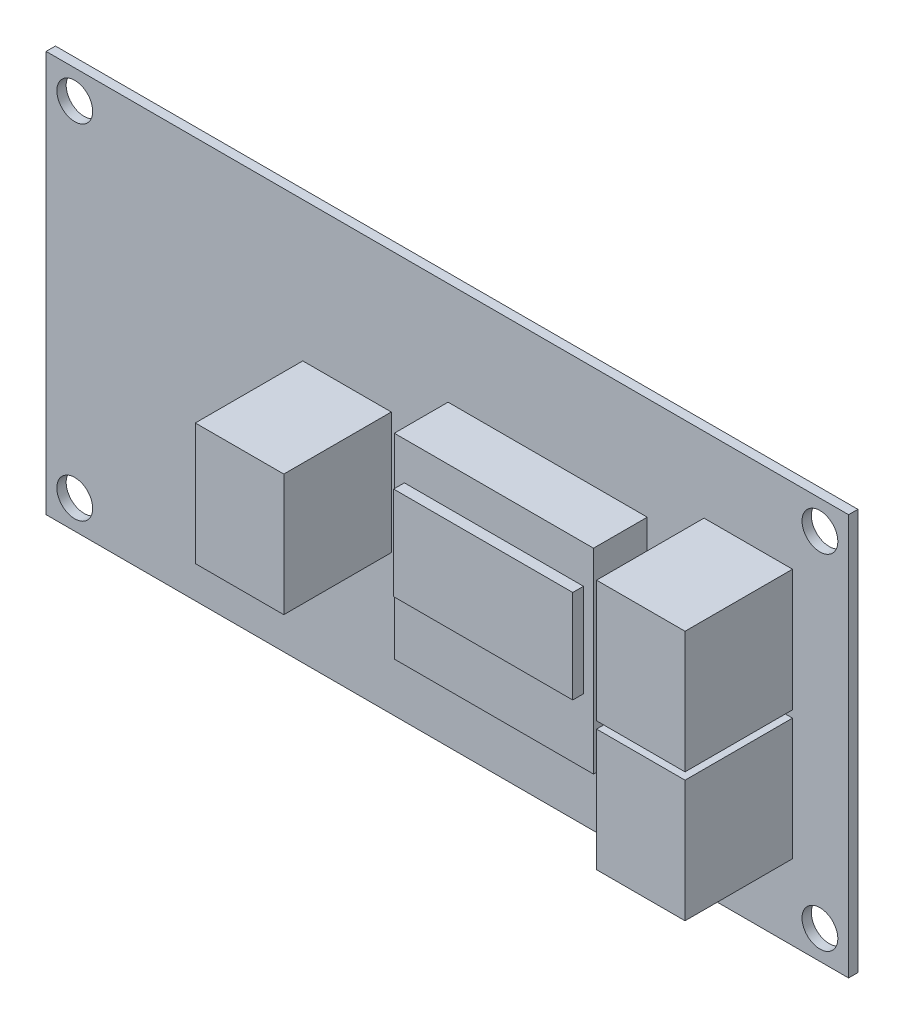
ISO-10303-21;
HEADER;
FILE_DESCRIPTION(('STEP AP214'),'2;1');
FILE_NAME('part.step','',(''),(''),'','','');
FILE_SCHEMA(('AUTOMOTIVE_DESIGN { 1 0 10303 214 1 1 1 1 }'));
ENDSEC;
DATA;
#1=APPLICATION_CONTEXT('core data for automotive mechanical design processes');
#2=APPLICATION_PROTOCOL_DEFINITION('international standard','automotive_design',2000,#1);
#3=PRODUCT_CONTEXT('',#1,'mechanical');
#4=PRODUCT('Part','Part','',(#3));
#5=PRODUCT_RELATED_PRODUCT_CATEGORY('part','',(#4));
#6=PRODUCT_DEFINITION_FORMATION('','',#4);
#7=PRODUCT_DEFINITION_CONTEXT('part definition',#1,'design');
#8=PRODUCT_DEFINITION('design','',#6,#7);
#9=PRODUCT_DEFINITION_SHAPE('','',#8);
#10=(LENGTH_UNIT() NAMED_UNIT(*) SI_UNIT(.MILLI.,.METRE.));
#11=(NAMED_UNIT(*) PLANE_ANGLE_UNIT() SI_UNIT($,.RADIAN.));
#12=(NAMED_UNIT(*) SI_UNIT($,.STERADIAN.) SOLID_ANGLE_UNIT());
#13=UNCERTAINTY_MEASURE_WITH_UNIT(LENGTH_MEASURE(1.E-05),#10,'distance_accuracy_value','');
#14=(GEOMETRIC_REPRESENTATION_CONTEXT(3) GLOBAL_UNCERTAINTY_ASSIGNED_CONTEXT((#13)) GLOBAL_UNIT_ASSIGNED_CONTEXT((#10,
#11,#12)) REPRESENTATION_CONTEXT('',''));
#15=CARTESIAN_POINT('',(0.,0.,0.));
#16=DIRECTION('',(0.,0.,1.));
#17=DIRECTION('',(1.,0.,0.));
#18=AXIS2_PLACEMENT_3D('',#15,#16,#17);
#19=CARTESIAN_POINT('',(0.,0.,1.3));
#20=DIRECTION('',(0.,0.,-1.));
#21=DIRECTION('',(-1.,0.,0.));
#22=AXIS2_PLACEMENT_3D('',#19,#20,#21);
#23=PLANE('',#22);
#24=DIRECTION('',(-1.,0.,0.));
#25=VECTOR('',#24,1.);
#26=CARTESIAN_POINT('',(0.,19.5,1.3));
#27=LINE('',#26,#25);
#28=CARTESIAN_POINT('',(-7.82500000000001,19.5,1.3));
#29=VERTEX_POINT('',#28);
#30=CARTESIAN_POINT('',(-20.175,19.5,1.3));
#31=VERTEX_POINT('',#30);
#32=EDGE_CURVE('E227',#29,#31,#27,.T.);
#33=ORIENTED_EDGE('',*,*,#32,.T.);
#34=DIRECTION('',(0.,1.,0.));
#35=VECTOR('',#34,1.);
#36=CARTESIAN_POINT('',(-20.175,0.,1.3));
#37=LINE('',#36,#35);
#38=CARTESIAN_POINT('',(-20.175,36.5,1.3));
#39=VERTEX_POINT('',#38);
#40=EDGE_CURVE('E201',#31,#39,#37,.T.);
#41=ORIENTED_EDGE('',*,*,#40,.T.);
#42=DIRECTION('',(1.,0.,0.));
#43=VECTOR('',#42,1.);
#44=CARTESIAN_POINT('',(0.,36.5,1.3));
#45=LINE('',#44,#43);
#46=CARTESIAN_POINT('',(-7.82500000000001,36.5,1.3));
#47=VERTEX_POINT('',#46);
#48=EDGE_CURVE('E217',#39,#47,#45,.T.);
#49=ORIENTED_EDGE('',*,*,#48,.T.);
#50=DIRECTION('',(0.,-1.,0.));
#51=VECTOR('',#50,1.);
#52=CARTESIAN_POINT('',(-7.82500000000001,0.,1.3));
#53=LINE('',#52,#51);
#54=EDGE_CURVE('E49',#47,#29,#53,.T.);
#55=ORIENTED_EDGE('',*,*,#54,.T.);
#56=EDGE_LOOP('',(#33,#41,#49,#55));
#57=FACE_BOUND('',#56,.T.);
#58=CARTESIAN_POINT('',(52.,3.99999999999998,1.3));
#59=DIRECTION('',(0.,0.,1.));
#60=DIRECTION('',(1.,0.,0.));
#61=AXIS2_PLACEMENT_3D('',#58,#59,#60);
#62=CIRCLE('',#61,2.5);
#63=CARTESIAN_POINT('',(54.5,3.99999999999998,1.3));
#64=VERTEX_POINT('',#63);
#65=EDGE_CURVE('E246',#64,#64,#62,.T.);
#66=ORIENTED_EDGE('',*,*,#65,.F.);
#67=EDGE_LOOP('',(#66));
#68=FACE_BOUND('',#67,.T.);
#69=CARTESIAN_POINT('',(-52.,52.,1.3));
#70=DIRECTION('',(0.,0.,1.));
#71=DIRECTION('',(1.,0.,0.));
#72=AXIS2_PLACEMENT_3D('',#69,#70,#71);
#73=CIRCLE('',#72,2.5);
#74=CARTESIAN_POINT('',(-49.5,52.,1.3));
#75=VERTEX_POINT('',#74);
#76=EDGE_CURVE('E239',#75,#75,#73,.T.);
#77=ORIENTED_EDGE('',*,*,#76,.F.);
#78=EDGE_LOOP('',(#77));
#79=FACE_BOUND('',#78,.T.);
#80=DIRECTION('',(0.,1.,0.));
#81=VECTOR('',#80,1.);
#82=CARTESIAN_POINT('',(35.825,0.,1.3));
#83=LINE('',#82,#81);
#84=CARTESIAN_POINT('',(35.825,10.5,1.3));
#85=VERTEX_POINT('',#84);
#86=CARTESIAN_POINT('',(35.825,27.5,1.3));
#87=VERTEX_POINT('',#86);
#88=EDGE_CURVE('E328',#85,#87,#83,.T.);
#89=ORIENTED_EDGE('',*,*,#88,.T.);
#90=DIRECTION('',(1.,0.,0.));
#91=VECTOR('',#90,1.);
#92=CARTESIAN_POINT('',(0.,27.5,1.3));
#93=LINE('',#92,#91);
#94=CARTESIAN_POINT('',(48.175,27.5,1.3));
#95=VERTEX_POINT('',#94);
#96=EDGE_CURVE('E325',#87,#95,#93,.T.);
#97=ORIENTED_EDGE('',*,*,#96,.T.);
#98=DIRECTION('',(0.,-1.,0.));
#99=VECTOR('',#98,1.);
#100=CARTESIAN_POINT('',(48.175,0.,1.3));
#101=LINE('',#100,#99);
#102=CARTESIAN_POINT('',(48.175,10.5,1.3));
#103=VERTEX_POINT('',#102);
#104=EDGE_CURVE('E334',#95,#103,#101,.T.);
#105=ORIENTED_EDGE('',*,*,#104,.T.);
#106=DIRECTION('',(-1.,0.,0.));
#107=VECTOR('',#106,1.);
#108=CARTESIAN_POINT('',(0.,10.5,1.3));
#109=LINE('',#108,#107);
#110=EDGE_CURVE('E331',#103,#85,#109,.T.);
#111=ORIENTED_EDGE('',*,*,#110,.T.);
#112=EDGE_LOOP('',(#89,#97,#105,#111));
#113=FACE_BOUND('',#112,.T.);
#114=DIRECTION('',(0.,-1.,0.));
#115=VECTOR('',#114,1.);
#116=CARTESIAN_POINT('',(0.100000000000011,0.,1.3));
#117=LINE('',#116,#115);
#118=CARTESIAN_POINT('',(0.100000000000006,41.65,1.3));
#119=VERTEX_POINT('',#118);
#120=CARTESIAN_POINT('',(0.10000000000001,14.35,1.3));
#121=VERTEX_POINT('',#120);
#122=EDGE_CURVE('E370',#119,#121,#117,.T.);
#123=ORIENTED_EDGE('',*,*,#122,.F.);
#124=DIRECTION('',(-1.,0.,0.));
#125=VECTOR('',#124,1.);
#126=CARTESIAN_POINT('',(0.,41.65,1.3));
#127=LINE('',#126,#125);
#128=CARTESIAN_POINT('',(27.9,41.65,1.3));
#129=VERTEX_POINT('',#128);
#130=EDGE_CURVE('E375',#129,#119,#127,.T.);
#131=ORIENTED_EDGE('',*,*,#130,.F.);
#132=DIRECTION('',(0.,1.,0.));
#133=VECTOR('',#132,1.);
#134=CARTESIAN_POINT('',(27.9,0.,1.3));
#135=LINE('',#134,#133);
#136=CARTESIAN_POINT('',(27.9,14.35,1.3));
#137=VERTEX_POINT('',#136);
#138=EDGE_CURVE('E387',#137,#129,#135,.T.);
#139=ORIENTED_EDGE('',*,*,#138,.F.);
#140=DIRECTION('',(1.,0.,0.));
#141=VECTOR('',#140,1.);
#142=CARTESIAN_POINT('',(0.,14.35,1.3));
#143=LINE('',#142,#141);
#144=EDGE_CURVE('E384',#121,#137,#143,.T.);
#145=ORIENTED_EDGE('',*,*,#144,.F.);
#146=EDGE_LOOP('',(#123,#131,#139,#145));
#147=FACE_BOUND('',#146,.T.);
#148=DIRECTION('',(-1.,0.,0.));
#149=VECTOR('',#148,1.);
#150=CARTESIAN_POINT('',(0.,56.,1.3));
#151=LINE('',#150,#149);
#152=CARTESIAN_POINT('',(56.,56.,1.3));
#153=VERTEX_POINT('',#152);
#154=CARTESIAN_POINT('',(-56.,56.,1.3));
#155=VERTEX_POINT('',#154);
#156=EDGE_CURVE('E409',#153,#155,#151,.T.);
#157=ORIENTED_EDGE('',*,*,#156,.T.);
#158=DIRECTION('',(0.,-1.,0.));
#159=VECTOR('',#158,1.);
#160=CARTESIAN_POINT('',(-56.,56.,1.3));
#161=LINE('',#160,#159);
#162=CARTESIAN_POINT('',(-56.,0.,1.3));
#163=VERTEX_POINT('',#162);
#164=EDGE_CURVE('E257',#155,#163,#161,.T.);
#165=ORIENTED_EDGE('',*,*,#164,.T.);
#166=DIRECTION('',(1.,0.,0.));
#167=VECTOR('',#166,1.);
#168=CARTESIAN_POINT('',(0.,0.,1.3));
#169=LINE('',#168,#167);
#170=CARTESIAN_POINT('',(56.,0.,1.3));
#171=VERTEX_POINT('',#170);
#172=EDGE_CURVE('E404',#163,#171,#169,.T.);
#173=ORIENTED_EDGE('',*,*,#172,.T.);
#174=DIRECTION('',(0.,1.,0.));
#175=VECTOR('',#174,1.);
#176=CARTESIAN_POINT('',(56.,0.,1.3));
#177=LINE('',#176,#175);
#178=EDGE_CURVE('E406',#171,#153,#177,.T.);
#179=ORIENTED_EDGE('',*,*,#178,.T.);
#180=EDGE_LOOP('',(#157,#165,#173,#179));
#181=FACE_BOUND('',#180,.T.);
#182=DIRECTION('',(0.,-1.,0.));
#183=VECTOR('',#182,1.);
#184=CARTESIAN_POINT('',(35.825,0.,1.3));
#185=LINE('',#184,#183);
#186=CARTESIAN_POINT('',(35.825,45.5,1.3));
#187=VERTEX_POINT('',#186);
#188=CARTESIAN_POINT('',(35.825,28.5,1.3));
#189=VERTEX_POINT('',#188);
#190=EDGE_CURVE('E346',#187,#189,#185,.T.);
#191=ORIENTED_EDGE('',*,*,#190,.F.);
#192=DIRECTION('',(-1.,0.,0.));
#193=VECTOR('',#192,1.);
#194=CARTESIAN_POINT('',(0.,45.5,1.3));
#195=LINE('',#194,#193);
#196=CARTESIAN_POINT('',(48.175,45.5,1.3));
#197=VERTEX_POINT('',#196);
#198=EDGE_CURVE('E355',#197,#187,#195,.T.);
#199=ORIENTED_EDGE('',*,*,#198,.F.);
#200=DIRECTION('',(0.,1.,0.));
#201=VECTOR('',#200,1.);
#202=CARTESIAN_POINT('',(48.175,0.,1.3));
#203=LINE('',#202,#201);
#204=CARTESIAN_POINT('',(48.175,28.5,1.3));
#205=VERTEX_POINT('',#204);
#206=EDGE_CURVE('E352',#205,#197,#203,.T.);
#207=ORIENTED_EDGE('',*,*,#206,.F.);
#208=DIRECTION('',(1.,0.,0.));
#209=VECTOR('',#208,1.);
#210=CARTESIAN_POINT('',(0.,28.5,1.3));
#211=LINE('',#210,#209);
#212=EDGE_CURVE('E349',#189,#205,#211,.T.);
#213=ORIENTED_EDGE('',*,*,#212,.F.);
#214=EDGE_LOOP('',(#191,#199,#207,#213));
#215=FACE_BOUND('',#214,.T.);
#216=CARTESIAN_POINT('',(-52.,4.00000000000001,1.3));
#217=DIRECTION('',(0.,0.,1.));
#218=DIRECTION('',(1.,0.,0.));
#219=AXIS2_PLACEMENT_3D('',#216,#217,#218);
#220=CIRCLE('',#219,2.5);
#221=CARTESIAN_POINT('',(-49.5,4.00000000000001,1.3));
#222=VERTEX_POINT('',#221);
#223=EDGE_CURVE('E240',#222,#222,#220,.F.);
#224=ORIENTED_EDGE('',*,*,#223,.T.);
#225=EDGE_LOOP('',(#224));
#226=FACE_BOUND('',#225,.T.);
#227=CARTESIAN_POINT('',(52.,52.,1.3));
#228=DIRECTION('',(0.,0.,1.));
#229=DIRECTION('',(1.,0.,0.));
#230=AXIS2_PLACEMENT_3D('',#227,#228,#229);
#231=CIRCLE('',#230,2.5);
#232=CARTESIAN_POINT('',(54.5,52.,1.3));
#233=VERTEX_POINT('',#232);
#234=EDGE_CURVE('E206',#233,#233,#231,.F.);
#235=ORIENTED_EDGE('',*,*,#234,.T.);
#236=EDGE_LOOP('',(#235));
#237=FACE_BOUND('',#236,.T.);
#238=ADVANCED_FACE('F34',(#57,#68,#79,#113,#147,#181,#215,#226,#237),#23,.F.);
#239=CARTESIAN_POINT('',(0.,0.,0.));
#240=DIRECTION('',(0.,0.,-1.));
#241=DIRECTION('',(-1.,0.,0.));
#242=AXIS2_PLACEMENT_3D('',#239,#240,#241);
#243=PLANE('',#242);
#244=CARTESIAN_POINT('',(-52.,4.00000000000001,0.));
#245=DIRECTION('',(0.,0.,1.));
#246=DIRECTION('',(1.,0.,0.));
#247=AXIS2_PLACEMENT_3D('',#244,#245,#246);
#248=CIRCLE('',#247,2.5);
#249=CARTESIAN_POINT('',(-49.5,4.00000000000001,0.));
#250=VERTEX_POINT('',#249);
#251=EDGE_CURVE('E236',#250,#250,#248,.F.);
#252=ORIENTED_EDGE('',*,*,#251,.F.);
#253=EDGE_LOOP('',(#252));
#254=FACE_BOUND('',#253,.T.);
#255=CARTESIAN_POINT('',(-52.,52.,0.));
#256=DIRECTION('',(0.,0.,1.));
#257=DIRECTION('',(1.,0.,0.));
#258=AXIS2_PLACEMENT_3D('',#255,#256,#257);
#259=CIRCLE('',#258,2.5);
#260=CARTESIAN_POINT('',(-49.5,52.,0.));
#261=VERTEX_POINT('',#260);
#262=EDGE_CURVE('E254',#261,#261,#259,.T.);
#263=ORIENTED_EDGE('',*,*,#262,.T.);
#264=EDGE_LOOP('',(#263));
#265=FACE_BOUND('',#264,.T.);
#266=DIRECTION('',(1.,0.,0.));
#267=VECTOR('',#266,1.);
#268=CARTESIAN_POINT('',(0.,0.,0.));
#269=LINE('',#268,#267);
#270=CARTESIAN_POINT('',(-56.,0.,0.));
#271=VERTEX_POINT('',#270);
#272=CARTESIAN_POINT('',(56.,0.,0.));
#273=VERTEX_POINT('',#272);
#274=EDGE_CURVE('E403',#271,#273,#269,.T.);
#275=ORIENTED_EDGE('',*,*,#274,.F.);
#276=DIRECTION('',(0.,-1.,0.));
#277=VECTOR('',#276,1.);
#278=CARTESIAN_POINT('',(-56.,56.,0.));
#279=LINE('',#278,#277);
#280=CARTESIAN_POINT('',(-56.,56.,0.));
#281=VERTEX_POINT('',#280);
#282=EDGE_CURVE('E260',#281,#271,#279,.T.);
#283=ORIENTED_EDGE('',*,*,#282,.F.);
#284=DIRECTION('',(-1.,0.,0.));
#285=VECTOR('',#284,1.);
#286=CARTESIAN_POINT('',(0.,56.,0.));
#287=LINE('',#286,#285);
#288=CARTESIAN_POINT('',(56.,56.,0.));
#289=VERTEX_POINT('',#288);
#290=EDGE_CURVE('E407',#289,#281,#287,.T.);
#291=ORIENTED_EDGE('',*,*,#290,.F.);
#292=DIRECTION('',(0.,1.,0.));
#293=VECTOR('',#292,1.);
#294=CARTESIAN_POINT('',(56.,0.,0.));
#295=LINE('',#294,#293);
#296=EDGE_CURVE('E412',#273,#289,#295,.T.);
#297=ORIENTED_EDGE('',*,*,#296,.F.);
#298=EDGE_LOOP('',(#275,#283,#291,#297));
#299=FACE_BOUND('',#298,.T.);
#300=CARTESIAN_POINT('',(52.,3.99999999999998,0.));
#301=DIRECTION('',(0.,0.,1.));
#302=DIRECTION('',(1.,0.,0.));
#303=AXIS2_PLACEMENT_3D('',#300,#301,#302);
#304=CIRCLE('',#303,2.5);
#305=CARTESIAN_POINT('',(54.5,3.99999999999998,0.));
#306=VERTEX_POINT('',#305);
#307=EDGE_CURVE('E243',#306,#306,#304,.T.);
#308=ORIENTED_EDGE('',*,*,#307,.T.);
#309=EDGE_LOOP('',(#308));
#310=FACE_BOUND('',#309,.T.);
#311=CARTESIAN_POINT('',(52.,52.,0.));
#312=DIRECTION('',(0.,0.,1.));
#313=DIRECTION('',(1.,0.,0.));
#314=AXIS2_PLACEMENT_3D('',#311,#312,#313);
#315=CIRCLE('',#314,2.5);
#316=CARTESIAN_POINT('',(54.5,52.,0.));
#317=VERTEX_POINT('',#316);
#318=EDGE_CURVE('E249',#317,#317,#315,.F.);
#319=ORIENTED_EDGE('',*,*,#318,.F.);
#320=EDGE_LOOP('',(#319));
#321=FACE_BOUND('',#320,.T.);
#322=ADVANCED_FACE('F426',(#254,#265,#299,#310,#321),#243,.T.);
#323=CARTESIAN_POINT('',(0.,0.,8.8));
#324=DIRECTION('',(0.,0.,1.));
#325=DIRECTION('',(1.,0.,0.));
#326=AXIS2_PLACEMENT_3D('',#323,#324,#325);
#327=PLANE('',#326);
#328=DIRECTION('',(0.,-1.,0.));
#329=VECTOR('',#328,1.);
#330=CARTESIAN_POINT('',(0.100000000000011,0.,8.8));
#331=LINE('',#330,#329);
#332=CARTESIAN_POINT('',(0.100000000000006,41.65,8.8));
#333=VERTEX_POINT('',#332);
#334=CARTESIAN_POINT('',(0.10000000000001,14.35,8.8));
#335=VERTEX_POINT('',#334);
#336=EDGE_CURVE('E371',#333,#335,#331,.T.);
#337=ORIENTED_EDGE('',*,*,#336,.T.);
#338=DIRECTION('',(1.,0.,0.));
#339=VECTOR('',#338,1.);
#340=CARTESIAN_POINT('',(0.,14.35,8.8));
#341=LINE('',#340,#339);
#342=CARTESIAN_POINT('',(27.9,14.35,8.8));
#343=VERTEX_POINT('',#342);
#344=EDGE_CURVE('E374',#335,#343,#341,.T.);
#345=ORIENTED_EDGE('',*,*,#344,.T.);
#346=DIRECTION('',(0.,1.,0.));
#347=VECTOR('',#346,1.);
#348=CARTESIAN_POINT('',(27.9,0.,8.8));
#349=LINE('',#348,#347);
#350=CARTESIAN_POINT('',(27.9,41.65,8.8));
#351=VERTEX_POINT('',#350);
#352=EDGE_CURVE('E377',#343,#351,#349,.T.);
#353=ORIENTED_EDGE('',*,*,#352,.T.);
#354=DIRECTION('',(-1.,0.,0.));
#355=VECTOR('',#354,1.);
#356=CARTESIAN_POINT('',(0.,41.65,8.8));
#357=LINE('',#356,#355);
#358=EDGE_CURVE('E379',#351,#333,#357,.T.);
#359=ORIENTED_EDGE('',*,*,#358,.T.);
#360=EDGE_LOOP('',(#337,#345,#353,#359));
#361=FACE_BOUND('',#360,.T.);
#362=DIRECTION('',(0.,-1.,0.));
#363=VECTOR('',#362,1.);
#364=CARTESIAN_POINT('',(26.5,0.,8.8));
#365=LINE('',#364,#363);
#366=CARTESIAN_POINT('',(26.5,36.35,8.8));
#367=VERTEX_POINT('',#366);
#368=CARTESIAN_POINT('',(26.5,23.35,8.8));
#369=VERTEX_POINT('',#368);
#370=EDGE_CURVE('E286',#367,#369,#365,.T.);
#371=ORIENTED_EDGE('',*,*,#370,.T.);
#372=DIRECTION('',(-1.,0.,0.));
#373=VECTOR('',#372,1.);
#374=CARTESIAN_POINT('',(0.,23.35,8.8));
#375=LINE('',#374,#373);
#376=CARTESIAN_POINT('',(1.50000000000001,23.35,8.8));
#377=VERTEX_POINT('',#376);
#378=EDGE_CURVE('E57',#369,#377,#375,.T.);
#379=ORIENTED_EDGE('',*,*,#378,.T.);
#380=DIRECTION('',(0.,1.,0.));
#381=VECTOR('',#380,1.);
#382=CARTESIAN_POINT('',(1.50000000000001,0.,8.8));
#383=LINE('',#382,#381);
#384=CARTESIAN_POINT('',(1.50000000000001,36.35,8.8));
#385=VERTEX_POINT('',#384);
#386=EDGE_CURVE('E275',#377,#385,#383,.T.);
#387=ORIENTED_EDGE('',*,*,#386,.T.);
#388=DIRECTION('',(1.,0.,0.));
#389=VECTOR('',#388,1.);
#390=CARTESIAN_POINT('',(0.,36.35,8.8));
#391=LINE('',#390,#389);
#392=EDGE_CURVE('E289',#385,#367,#391,.T.);
#393=ORIENTED_EDGE('',*,*,#392,.T.);
#394=EDGE_LOOP('',(#371,#379,#387,#393));
#395=FACE_BOUND('',#394,.T.);
#396=ADVANCED_FACE('F438',(#361,#395),#327,.T.);
#397=CARTESIAN_POINT('',(0.,0.,1.3));
#398=DIRECTION('',(0.,1.,0.));
#399=DIRECTION('',(0.,0.,1.));
#400=AXIS2_PLACEMENT_3D('',#397,#398,#399);
#401=PLANE('',#400);
#402=ORIENTED_EDGE('',*,*,#274,.T.);
#403=DIRECTION('',(0.,0.,-1.));
#404=VECTOR('',#403,1.);
#405=CARTESIAN_POINT('',(56.,0.,1.3));
#406=LINE('',#405,#404);
#407=EDGE_CURVE('E11',#171,#273,#406,.T.);
#408=ORIENTED_EDGE('',*,*,#407,.F.);
#409=ORIENTED_EDGE('',*,*,#172,.F.);
#410=DIRECTION('',(0.,0.,1.));
#411=VECTOR('',#410,1.);
#412=CARTESIAN_POINT('',(-56.,0.,0.));
#413=LINE('',#412,#411);
#414=EDGE_CURVE('E266',#271,#163,#413,.T.);
#415=ORIENTED_EDGE('',*,*,#414,.F.);
#416=EDGE_LOOP('',(#402,#408,#409,#415));
#417=FACE_BOUND('',#416,.T.);
#418=ADVANCED_FACE('F36',(#417),#401,.F.);
#419=CARTESIAN_POINT('',(56.,0.,1.3));
#420=DIRECTION('',(-1.,0.,0.));
#421=DIRECTION('',(0.,0.,1.));
#422=AXIS2_PLACEMENT_3D('',#419,#420,#421);
#423=PLANE('',#422);
#424=ORIENTED_EDGE('',*,*,#296,.T.);
#425=DIRECTION('',(0.,0.,-1.));
#426=VECTOR('',#425,1.);
#427=CARTESIAN_POINT('',(56.,56.,1.3));
#428=LINE('',#427,#426);
#429=EDGE_CURVE('E42',#153,#289,#428,.T.);
#430=ORIENTED_EDGE('',*,*,#429,.F.);
#431=ORIENTED_EDGE('',*,*,#178,.F.);
#432=ORIENTED_EDGE('',*,*,#407,.T.);
#433=EDGE_LOOP('',(#424,#430,#431,#432));
#434=FACE_BOUND('',#433,.T.);
#435=ADVANCED_FACE('F435',(#434),#423,.F.);
#436=CARTESIAN_POINT('',(0.,56.,1.3));
#437=DIRECTION('',(0.,-1.,0.));
#438=DIRECTION('',(0.,0.,-1.));
#439=AXIS2_PLACEMENT_3D('',#436,#437,#438);
#440=PLANE('',#439);
#441=ORIENTED_EDGE('',*,*,#290,.T.);
#442=DIRECTION('',(0.,0.,1.));
#443=VECTOR('',#442,1.);
#444=CARTESIAN_POINT('',(-56.,56.,0.));
#445=LINE('',#444,#443);
#446=EDGE_CURVE('E263',#281,#155,#445,.T.);
#447=ORIENTED_EDGE('',*,*,#446,.T.);
#448=ORIENTED_EDGE('',*,*,#156,.F.);
#449=ORIENTED_EDGE('',*,*,#429,.T.);
#450=EDGE_LOOP('',(#441,#447,#448,#449));
#451=FACE_BOUND('',#450,.T.);
#452=ADVANCED_FACE('F419',(#451),#440,.F.);
#453=CARTESIAN_POINT('',(0.100000000000011,0.,8.8));
#454=DIRECTION('',(1.,0.,0.));
#455=DIRECTION('',(0.,1.,0.));
#456=AXIS2_PLACEMENT_3D('',#453,#454,#455);
#457=PLANE('',#456);
#458=ORIENTED_EDGE('',*,*,#122,.T.);
#459=DIRECTION('',(0.,0.,-1.));
#460=VECTOR('',#459,1.);
#461=CARTESIAN_POINT('',(0.10000000000001,14.35,8.8));
#462=LINE('',#461,#460);
#463=EDGE_CURVE('E400',#335,#121,#462,.T.);
#464=ORIENTED_EDGE('',*,*,#463,.F.);
#465=ORIENTED_EDGE('',*,*,#336,.F.);
#466=DIRECTION('',(0.,0.,-1.));
#467=VECTOR('',#466,1.);
#468=CARTESIAN_POINT('',(0.100000000000006,41.65,8.8));
#469=LINE('',#468,#467);
#470=EDGE_CURVE('E381',#333,#119,#469,.T.);
#471=ORIENTED_EDGE('',*,*,#470,.T.);
#472=EDGE_LOOP('',(#458,#464,#465,#471));
#473=FACE_BOUND('',#472,.T.);
#474=ADVANCED_FACE('F459',(#473),#457,.F.);
#475=CARTESIAN_POINT('',(0.,14.35,8.8));
#476=DIRECTION('',(0.,1.,0.));
#477=DIRECTION('',(0.,0.,1.));
#478=AXIS2_PLACEMENT_3D('',#475,#476,#477);
#479=PLANE('',#478);
#480=ORIENTED_EDGE('',*,*,#144,.T.);
#481=DIRECTION('',(0.,0.,-1.));
#482=VECTOR('',#481,1.);
#483=CARTESIAN_POINT('',(27.9,14.35,8.8));
#484=LINE('',#483,#482);
#485=EDGE_CURVE('E397',#343,#137,#484,.T.);
#486=ORIENTED_EDGE('',*,*,#485,.F.);
#487=ORIENTED_EDGE('',*,*,#344,.F.);
#488=ORIENTED_EDGE('',*,*,#463,.T.);
#489=EDGE_LOOP('',(#480,#486,#487,#488));
#490=FACE_BOUND('',#489,.T.);
#491=ADVANCED_FACE('F466',(#490),#479,.F.);
#492=CARTESIAN_POINT('',(27.9,0.,8.8));
#493=DIRECTION('',(-1.,0.,0.));
#494=DIRECTION('',(0.,0.,1.));
#495=AXIS2_PLACEMENT_3D('',#492,#493,#494);
#496=PLANE('',#495);
#497=ORIENTED_EDGE('',*,*,#138,.T.);
#498=DIRECTION('',(0.,0.,-1.));
#499=VECTOR('',#498,1.);
#500=CARTESIAN_POINT('',(27.9,41.65,8.8));
#501=LINE('',#500,#499);
#502=EDGE_CURVE('E394',#351,#129,#501,.T.);
#503=ORIENTED_EDGE('',*,*,#502,.F.);
#504=ORIENTED_EDGE('',*,*,#352,.F.);
#505=ORIENTED_EDGE('',*,*,#485,.T.);
#506=EDGE_LOOP('',(#497,#503,#504,#505));
#507=FACE_BOUND('',#506,.T.);
#508=ADVANCED_FACE('F471',(#507),#496,.F.);
#509=CARTESIAN_POINT('',(0.,41.65,8.8));
#510=DIRECTION('',(0.,-1.,0.));
#511=DIRECTION('',(0.,0.,-1.));
#512=AXIS2_PLACEMENT_3D('',#509,#510,#511);
#513=PLANE('',#512);
#514=ORIENTED_EDGE('',*,*,#130,.T.);
#515=ORIENTED_EDGE('',*,*,#470,.F.);
#516=ORIENTED_EDGE('',*,*,#358,.F.);
#517=ORIENTED_EDGE('',*,*,#502,.T.);
#518=EDGE_LOOP('',(#514,#515,#516,#517));
#519=FACE_BOUND('',#518,.T.);
#520=ADVANCED_FACE('F478',(#519),#513,.F.);
#521=CARTESIAN_POINT('',(35.825,0.,8.8));
#522=DIRECTION('',(1.,0.,0.));
#523=DIRECTION('',(0.,0.,-1.));
#524=AXIS2_PLACEMENT_3D('',#521,#522,#523);
#525=PLANE('',#524);
#526=ORIENTED_EDGE('',*,*,#190,.T.);
#527=DIRECTION('',(0.,0.,-1.));
#528=VECTOR('',#527,1.);
#529=CARTESIAN_POINT('',(35.825,28.5,8.8));
#530=LINE('',#529,#528);
#531=CARTESIAN_POINT('',(35.825,28.5,16.3));
#532=VERTEX_POINT('',#531);
#533=EDGE_CURVE('E367',#532,#189,#530,.T.);
#534=ORIENTED_EDGE('',*,*,#533,.F.);
#535=DIRECTION('',(0.,-1.,0.));
#536=VECTOR('',#535,1.);
#537=CARTESIAN_POINT('',(35.825,45.5,16.3));
#538=LINE('',#537,#536);
#539=CARTESIAN_POINT('',(35.825,45.5,16.3));
#540=VERTEX_POINT('',#539);
#541=EDGE_CURVE('E313',#540,#532,#538,.T.);
#542=ORIENTED_EDGE('',*,*,#541,.F.);
#543=DIRECTION('',(0.,0.,-1.));
#544=VECTOR('',#543,1.);
#545=CARTESIAN_POINT('',(35.825,45.5,8.8));
#546=LINE('',#545,#544);
#547=EDGE_CURVE('E358',#540,#187,#546,.T.);
#548=ORIENTED_EDGE('',*,*,#547,.T.);
#549=EDGE_LOOP('',(#526,#534,#542,#548));
#550=FACE_BOUND('',#549,.T.);
#551=ADVANCED_FACE('F548',(#550),#525,.F.);
#552=CARTESIAN_POINT('',(0.,28.5,8.8));
#553=DIRECTION('',(0.,1.,0.));
#554=DIRECTION('',(-1.,0.,0.));
#555=AXIS2_PLACEMENT_3D('',#552,#553,#554);
#556=PLANE('',#555);
#557=ORIENTED_EDGE('',*,*,#212,.T.);
#558=DIRECTION('',(0.,0.,-1.));
#559=VECTOR('',#558,1.);
#560=CARTESIAN_POINT('',(48.175,28.5,8.8));
#561=LINE('',#560,#559);
#562=CARTESIAN_POINT('',(48.175,28.5,16.3));
#563=VERTEX_POINT('',#562);
#564=EDGE_CURVE('E364',#563,#205,#561,.T.);
#565=ORIENTED_EDGE('',*,*,#564,.F.);
#566=DIRECTION('',(1.,0.,0.));
#567=VECTOR('',#566,1.);
#568=CARTESIAN_POINT('',(35.825,28.5,16.3));
#569=LINE('',#568,#567);
#570=EDGE_CURVE('E316',#532,#563,#569,.T.);
#571=ORIENTED_EDGE('',*,*,#570,.F.);
#572=ORIENTED_EDGE('',*,*,#533,.T.);
#573=EDGE_LOOP('',(#557,#565,#571,#572));
#574=FACE_BOUND('',#573,.T.);
#575=ADVANCED_FACE('F544',(#574),#556,.F.);
#576=CARTESIAN_POINT('',(48.175,0.,8.8));
#577=DIRECTION('',(-1.,0.,0.));
#578=DIRECTION('',(0.,0.,1.));
#579=AXIS2_PLACEMENT_3D('',#576,#577,#578);
#580=PLANE('',#579);
#581=ORIENTED_EDGE('',*,*,#206,.T.);
#582=DIRECTION('',(0.,0.,-1.));
#583=VECTOR('',#582,1.);
#584=CARTESIAN_POINT('',(48.175,45.5,8.8));
#585=LINE('',#584,#583);
#586=CARTESIAN_POINT('',(48.175,45.5,16.3));
#587=VERTEX_POINT('',#586);
#588=EDGE_CURVE('E361',#587,#197,#585,.T.);
#589=ORIENTED_EDGE('',*,*,#588,.F.);
#590=DIRECTION('',(0.,1.,0.));
#591=VECTOR('',#590,1.);
#592=CARTESIAN_POINT('',(48.175,45.5,16.3));
#593=LINE('',#592,#591);
#594=EDGE_CURVE('E319',#563,#587,#593,.T.);
#595=ORIENTED_EDGE('',*,*,#594,.F.);
#596=ORIENTED_EDGE('',*,*,#564,.T.);
#597=EDGE_LOOP('',(#581,#589,#595,#596));
#598=FACE_BOUND('',#597,.T.);
#599=ADVANCED_FACE('F540',(#598),#580,.F.);
#600=CARTESIAN_POINT('',(0.,45.5,8.8));
#601=DIRECTION('',(0.,-1.,0.));
#602=DIRECTION('',(0.,0.,-1.));
#603=AXIS2_PLACEMENT_3D('',#600,#601,#602);
#604=PLANE('',#603);
#605=ORIENTED_EDGE('',*,*,#198,.T.);
#606=ORIENTED_EDGE('',*,*,#547,.F.);
#607=DIRECTION('',(-1.,0.,0.));
#608=VECTOR('',#607,1.);
#609=CARTESIAN_POINT('',(35.825,45.5,16.3));
#610=LINE('',#609,#608);
#611=EDGE_CURVE('E322',#587,#540,#610,.T.);
#612=ORIENTED_EDGE('',*,*,#611,.F.);
#613=ORIENTED_EDGE('',*,*,#588,.T.);
#614=EDGE_LOOP('',(#605,#606,#612,#613));
#615=FACE_BOUND('',#614,.T.);
#616=ADVANCED_FACE('F536',(#615),#604,.F.);
#617=CARTESIAN_POINT('',(0.,27.5,8.8));
#618=DIRECTION('',(0.,1.,0.));
#619=DIRECTION('',(-1.,0.,0.));
#620=AXIS2_PLACEMENT_3D('',#617,#618,#619);
#621=PLANE('',#620);
#622=ORIENTED_EDGE('',*,*,#96,.F.);
#623=DIRECTION('',(0.,0.,-1.));
#624=VECTOR('',#623,1.);
#625=CARTESIAN_POINT('',(35.825,27.5,8.8));
#626=LINE('',#625,#624);
#627=CARTESIAN_POINT('',(35.825,27.5,16.3));
#628=VERTEX_POINT('',#627);
#629=EDGE_CURVE('E344',#628,#87,#626,.T.);
#630=ORIENTED_EDGE('',*,*,#629,.F.);
#631=DIRECTION('',(-1.,0.,0.));
#632=VECTOR('',#631,1.);
#633=CARTESIAN_POINT('',(35.825,27.5,16.3));
#634=LINE('',#633,#632);
#635=CARTESIAN_POINT('',(48.175,27.5,16.3));
#636=VERTEX_POINT('',#635);
#637=EDGE_CURVE('E310',#636,#628,#634,.T.);
#638=ORIENTED_EDGE('',*,*,#637,.F.);
#639=DIRECTION('',(0.,0.,-1.));
#640=VECTOR('',#639,1.);
#641=CARTESIAN_POINT('',(48.175,27.5,8.8));
#642=LINE('',#641,#640);
#643=EDGE_CURVE('E337',#636,#95,#642,.T.);
#644=ORIENTED_EDGE('',*,*,#643,.T.);
#645=EDGE_LOOP('',(#622,#630,#638,#644));
#646=FACE_BOUND('',#645,.T.);
#647=ADVANCED_FACE('F532',(#646),#621,.T.);
#648=CARTESIAN_POINT('',(35.825,0.,8.8));
#649=DIRECTION('',(-1.,0.,0.));
#650=DIRECTION('',(0.,0.,1.));
#651=AXIS2_PLACEMENT_3D('',#648,#649,#650);
#652=PLANE('',#651);
#653=ORIENTED_EDGE('',*,*,#88,.F.);
#654=DIRECTION('',(0.,0.,-1.));
#655=VECTOR('',#654,1.);
#656=CARTESIAN_POINT('',(35.825,10.5,8.8));
#657=LINE('',#656,#655);
#658=CARTESIAN_POINT('',(35.825,10.5,16.3));
#659=VERTEX_POINT('',#658);
#660=EDGE_CURVE('E342',#659,#85,#657,.T.);
#661=ORIENTED_EDGE('',*,*,#660,.F.);
#662=DIRECTION('',(0.,-1.,0.));
#663=VECTOR('',#662,1.);
#664=CARTESIAN_POINT('',(35.825,27.5,16.3));
#665=LINE('',#664,#663);
#666=EDGE_CURVE('E301',#628,#659,#665,.T.);
#667=ORIENTED_EDGE('',*,*,#666,.F.);
#668=ORIENTED_EDGE('',*,*,#629,.T.);
#669=EDGE_LOOP('',(#653,#661,#667,#668));
#670=FACE_BOUND('',#669,.T.);
#671=ADVANCED_FACE('F528',(#670),#652,.T.);
#672=CARTESIAN_POINT('',(0.,10.5,8.8));
#673=DIRECTION('',(0.,-1.,0.));
#674=DIRECTION('',(0.,0.,-1.));
#675=AXIS2_PLACEMENT_3D('',#672,#673,#674);
#676=PLANE('',#675);
#677=ORIENTED_EDGE('',*,*,#110,.F.);
#678=DIRECTION('',(0.,0.,-1.));
#679=VECTOR('',#678,1.);
#680=CARTESIAN_POINT('',(48.175,10.5,8.8));
#681=LINE('',#680,#679);
#682=CARTESIAN_POINT('',(48.175,10.5,16.3));
#683=VERTEX_POINT('',#682);
#684=EDGE_CURVE('E339',#683,#103,#681,.T.);
#685=ORIENTED_EDGE('',*,*,#684,.F.);
#686=DIRECTION('',(1.,0.,0.));
#687=VECTOR('',#686,1.);
#688=CARTESIAN_POINT('',(35.825,10.5,16.3));
#689=LINE('',#688,#687);
#690=EDGE_CURVE('E304',#659,#683,#689,.T.);
#691=ORIENTED_EDGE('',*,*,#690,.F.);
#692=ORIENTED_EDGE('',*,*,#660,.T.);
#693=EDGE_LOOP('',(#677,#685,#691,#692));
#694=FACE_BOUND('',#693,.T.);
#695=ADVANCED_FACE('F524',(#694),#676,.T.);
#696=CARTESIAN_POINT('',(48.175,0.,8.8));
#697=DIRECTION('',(1.,0.,0.));
#698=DIRECTION('',(0.,0.,-1.));
#699=AXIS2_PLACEMENT_3D('',#696,#697,#698);
#700=PLANE('',#699);
#701=ORIENTED_EDGE('',*,*,#104,.F.);
#702=ORIENTED_EDGE('',*,*,#643,.F.);
#703=DIRECTION('',(0.,1.,0.));
#704=VECTOR('',#703,1.);
#705=CARTESIAN_POINT('',(48.175,27.5,16.3));
#706=LINE('',#705,#704);
#707=EDGE_CURVE('E307',#683,#636,#706,.T.);
#708=ORIENTED_EDGE('',*,*,#707,.F.);
#709=ORIENTED_EDGE('',*,*,#684,.T.);
#710=EDGE_LOOP('',(#701,#702,#708,#709));
#711=FACE_BOUND('',#710,.T.);
#712=ADVANCED_FACE('F520',(#711),#700,.T.);
#713=CARTESIAN_POINT('',(0.,0.,16.3));
#714=DIRECTION('',(0.,0.,1.));
#715=DIRECTION('',(1.,0.,0.));
#716=AXIS2_PLACEMENT_3D('',#713,#714,#715);
#717=PLANE('',#716);
#718=ORIENTED_EDGE('',*,*,#541,.T.);
#719=ORIENTED_EDGE('',*,*,#570,.T.);
#720=ORIENTED_EDGE('',*,*,#594,.T.);
#721=ORIENTED_EDGE('',*,*,#611,.T.);
#722=EDGE_LOOP('',(#718,#719,#720,#721));
#723=FACE_BOUND('',#722,.T.);
#724=ADVANCED_FACE('F516',(#723),#717,.T.);
#725=CARTESIAN_POINT('',(0.,0.,16.3));
#726=DIRECTION('',(0.,0.,1.));
#727=DIRECTION('',(1.,0.,0.));
#728=AXIS2_PLACEMENT_3D('',#725,#726,#727);
#729=PLANE('',#728);
#730=ORIENTED_EDGE('',*,*,#666,.T.);
#731=ORIENTED_EDGE('',*,*,#690,.T.);
#732=ORIENTED_EDGE('',*,*,#707,.T.);
#733=ORIENTED_EDGE('',*,*,#637,.T.);
#734=EDGE_LOOP('',(#730,#731,#732,#733));
#735=FACE_BOUND('',#734,.T.);
#736=ADVANCED_FACE('F513',(#735),#729,.T.);
#737=CARTESIAN_POINT('',(0.,23.35,10.3));
#738=DIRECTION('',(0.,-1.,0.));
#739=DIRECTION('',(0.,0.,-1.));
#740=AXIS2_PLACEMENT_3D('',#737,#738,#739);
#741=PLANE('',#740);
#742=ORIENTED_EDGE('',*,*,#378,.F.);
#743=DIRECTION('',(0.,0.,-1.));
#744=VECTOR('',#743,1.);
#745=CARTESIAN_POINT('',(26.5,23.35,10.3));
#746=LINE('',#745,#744);
#747=CARTESIAN_POINT('',(26.5,23.35,10.3));
#748=VERTEX_POINT('',#747);
#749=EDGE_CURVE('E299',#748,#369,#746,.T.);
#750=ORIENTED_EDGE('',*,*,#749,.F.);
#751=DIRECTION('',(-1.,0.,0.));
#752=VECTOR('',#751,1.);
#753=CARTESIAN_POINT('',(0.,23.35,10.3));
#754=LINE('',#753,#752);
#755=CARTESIAN_POINT('',(1.50000000000001,23.35,10.3));
#756=VERTEX_POINT('',#755);
#757=EDGE_CURVE('E271',#748,#756,#754,.T.);
#758=ORIENTED_EDGE('',*,*,#757,.T.);
#759=DIRECTION('',(0.,0.,-1.));
#760=VECTOR('',#759,1.);
#761=CARTESIAN_POINT('',(1.50000000000001,23.35,10.3));
#762=LINE('',#761,#760);
#763=EDGE_CURVE('E284',#756,#377,#762,.T.);
#764=ORIENTED_EDGE('',*,*,#763,.T.);
#765=EDGE_LOOP('',(#742,#750,#758,#764));
#766=FACE_BOUND('',#765,.T.);
#767=ADVANCED_FACE('F491',(#766),#741,.T.);
#768=CARTESIAN_POINT('',(26.5,0.,10.3));
#769=DIRECTION('',(1.,0.,0.));
#770=DIRECTION('',(0.,0.,-1.));
#771=AXIS2_PLACEMENT_3D('',#768,#769,#770);
#772=PLANE('',#771);
#773=ORIENTED_EDGE('',*,*,#370,.F.);
#774=DIRECTION('',(0.,0.,-1.));
#775=VECTOR('',#774,1.);
#776=CARTESIAN_POINT('',(26.5,36.35,10.3));
#777=LINE('',#776,#775);
#778=CARTESIAN_POINT('',(26.5,36.35,10.3));
#779=VERTEX_POINT('',#778);
#780=EDGE_CURVE('E297',#779,#367,#777,.T.);
#781=ORIENTED_EDGE('',*,*,#780,.F.);
#782=DIRECTION('',(0.,-1.,0.));
#783=VECTOR('',#782,1.);
#784=CARTESIAN_POINT('',(26.5,0.,10.3));
#785=LINE('',#784,#783);
#786=EDGE_CURVE('E274',#779,#748,#785,.T.);
#787=ORIENTED_EDGE('',*,*,#786,.T.);
#788=ORIENTED_EDGE('',*,*,#749,.T.);
#789=EDGE_LOOP('',(#773,#781,#787,#788));
#790=FACE_BOUND('',#789,.T.);
#791=ADVANCED_FACE('F488',(#790),#772,.T.);
#792=CARTESIAN_POINT('',(0.,36.35,10.3));
#793=DIRECTION('',(0.,1.,0.));
#794=DIRECTION('',(0.,0.,1.));
#795=AXIS2_PLACEMENT_3D('',#792,#793,#794);
#796=PLANE('',#795);
#797=ORIENTED_EDGE('',*,*,#392,.F.);
#798=DIRECTION('',(0.,0.,-1.));
#799=VECTOR('',#798,1.);
#800=CARTESIAN_POINT('',(1.50000000000001,36.35,10.3));
#801=LINE('',#800,#799);
#802=CARTESIAN_POINT('',(1.50000000000001,36.35,10.3));
#803=VERTEX_POINT('',#802);
#804=EDGE_CURVE('E295',#803,#385,#801,.T.);
#805=ORIENTED_EDGE('',*,*,#804,.F.);
#806=DIRECTION('',(1.,0.,0.));
#807=VECTOR('',#806,1.);
#808=CARTESIAN_POINT('',(0.,36.35,10.3));
#809=LINE('',#808,#807);
#810=EDGE_CURVE('E278',#803,#779,#809,.T.);
#811=ORIENTED_EDGE('',*,*,#810,.T.);
#812=ORIENTED_EDGE('',*,*,#780,.T.);
#813=EDGE_LOOP('',(#797,#805,#811,#812));
#814=FACE_BOUND('',#813,.T.);
#815=ADVANCED_FACE('F500',(#814),#796,.T.);
#816=CARTESIAN_POINT('',(1.50000000000001,0.,10.3));
#817=DIRECTION('',(-1.,0.,0.));
#818=DIRECTION('',(0.,0.,1.));
#819=AXIS2_PLACEMENT_3D('',#816,#817,#818);
#820=PLANE('',#819);
#821=ORIENTED_EDGE('',*,*,#386,.F.);
#822=ORIENTED_EDGE('',*,*,#763,.F.);
#823=DIRECTION('',(0.,1.,0.));
#824=VECTOR('',#823,1.);
#825=CARTESIAN_POINT('',(1.50000000000001,0.,10.3));
#826=LINE('',#825,#824);
#827=EDGE_CURVE('E281',#756,#803,#826,.T.);
#828=ORIENTED_EDGE('',*,*,#827,.T.);
#829=ORIENTED_EDGE('',*,*,#804,.T.);
#830=EDGE_LOOP('',(#821,#822,#828,#829));
#831=FACE_BOUND('',#830,.T.);
#832=ADVANCED_FACE('F498',(#831),#820,.T.);
#833=CARTESIAN_POINT('',(0.,0.,10.3));
#834=DIRECTION('',(0.,0.,1.));
#835=DIRECTION('',(1.,0.,0.));
#836=AXIS2_PLACEMENT_3D('',#833,#834,#835);
#837=PLANE('',#836);
#838=ORIENTED_EDGE('',*,*,#757,.F.);
#839=ORIENTED_EDGE('',*,*,#786,.F.);
#840=ORIENTED_EDGE('',*,*,#810,.F.);
#841=ORIENTED_EDGE('',*,*,#827,.F.);
#842=EDGE_LOOP('',(#838,#839,#840,#841));
#843=FACE_BOUND('',#842,.T.);
#844=ADVANCED_FACE('F494',(#843),#837,.T.);
#845=CARTESIAN_POINT('',(-56.,56.,0.));
#846=DIRECTION('',(-1.,0.,0.));
#847=DIRECTION('',(0.,-1.,0.));
#848=AXIS2_PLACEMENT_3D('',#845,#846,#847);
#849=PLANE('',#848);
#850=ORIENTED_EDGE('',*,*,#164,.F.);
#851=ORIENTED_EDGE('',*,*,#446,.F.);
#852=ORIENTED_EDGE('',*,*,#282,.T.);
#853=ORIENTED_EDGE('',*,*,#414,.T.);
#854=EDGE_LOOP('',(#850,#851,#852,#853));
#855=FACE_BOUND('',#854,.T.);
#856=ADVANCED_FACE('F431',(#855),#849,.T.);
#857=CARTESIAN_POINT('',(-52.,52.,0.));
#858=DIRECTION('',(0.,0.,1.));
#859=DIRECTION('',(1.,0.,0.));
#860=AXIS2_PLACEMENT_3D('',#857,#858,#859);
#861=CYLINDRICAL_SURFACE('',#860,2.5);
#862=ORIENTED_EDGE('',*,*,#262,.F.);
#863=EDGE_LOOP('',(#862));
#864=FACE_BOUND('',#863,.T.);
#865=ORIENTED_EDGE('',*,*,#76,.T.);
#866=EDGE_LOOP('',(#865));
#867=FACE_BOUND('',#866,.T.);
#868=ADVANCED_FACE('F646',(#864,#867),#861,.F.);
#869=CARTESIAN_POINT('',(-52.,4.00000000000001,0.));
#870=DIRECTION('',(0.,0.,1.));
#871=DIRECTION('',(1.,0.,0.));
#872=AXIS2_PLACEMENT_3D('',#869,#870,#871);
#873=CYLINDRICAL_SURFACE('',#872,2.5);
#874=ORIENTED_EDGE('',*,*,#251,.T.);
#875=EDGE_LOOP('',(#874));
#876=FACE_BOUND('',#875,.T.);
#877=ORIENTED_EDGE('',*,*,#223,.F.);
#878=EDGE_LOOP('',(#877));
#879=FACE_BOUND('',#878,.T.);
#880=ADVANCED_FACE('F661',(#876,#879),#873,.F.);
#881=CARTESIAN_POINT('',(52.,3.99999999999998,0.));
#882=DIRECTION('',(0.,0.,1.));
#883=DIRECTION('',(1.,0.,0.));
#884=AXIS2_PLACEMENT_3D('',#881,#882,#883);
#885=CYLINDRICAL_SURFACE('',#884,2.5);
#886=ORIENTED_EDGE('',*,*,#307,.F.);
#887=EDGE_LOOP('',(#886));
#888=FACE_BOUND('',#887,.T.);
#889=ORIENTED_EDGE('',*,*,#65,.T.);
#890=EDGE_LOOP('',(#889));
#891=FACE_BOUND('',#890,.T.);
#892=ADVANCED_FACE('F672',(#888,#891),#885,.F.);
#893=CARTESIAN_POINT('',(52.,52.,0.));
#894=DIRECTION('',(0.,0.,1.));
#895=DIRECTION('',(1.,0.,0.));
#896=AXIS2_PLACEMENT_3D('',#893,#894,#895);
#897=CYLINDRICAL_SURFACE('',#896,2.5);
#898=ORIENTED_EDGE('',*,*,#318,.T.);
#899=EDGE_LOOP('',(#898));
#900=FACE_BOUND('',#899,.T.);
#901=ORIENTED_EDGE('',*,*,#234,.F.);
#902=EDGE_LOOP('',(#901));
#903=FACE_BOUND('',#902,.T.);
#904=ADVANCED_FACE('F681',(#900,#903),#897,.F.);
#905=CARTESIAN_POINT('',(-20.175,0.,16.3));
#906=DIRECTION('',(-1.,0.,0.));
#907=DIRECTION('',(0.,0.,1.));
#908=AXIS2_PLACEMENT_3D('',#905,#906,#907);
#909=PLANE('',#908);
#910=ORIENTED_EDGE('',*,*,#40,.F.);
#911=DIRECTION('',(0.,0.,-1.));
#912=VECTOR('',#911,1.);
#913=CARTESIAN_POINT('',(-20.175,19.5,16.3));
#914=LINE('',#913,#912);
#915=CARTESIAN_POINT('',(-20.175,19.5,16.3));
#916=VERTEX_POINT('',#915);
#917=EDGE_CURVE('E195',#916,#31,#914,.T.);
#918=ORIENTED_EDGE('',*,*,#917,.F.);
#919=DIRECTION('',(0.,1.,0.));
#920=VECTOR('',#919,1.);
#921=CARTESIAN_POINT('',(-20.175,0.,16.3));
#922=LINE('',#921,#920);
#923=CARTESIAN_POINT('',(-20.175,36.5,16.3));
#924=VERTEX_POINT('',#923);
#925=EDGE_CURVE('E198',#916,#924,#922,.T.);
#926=ORIENTED_EDGE('',*,*,#925,.T.);
#927=DIRECTION('',(0.,0.,-1.));
#928=VECTOR('',#927,1.);
#929=CARTESIAN_POINT('',(-20.175,36.5,16.3));
#930=LINE('',#929,#928);
#931=EDGE_CURVE('E225',#924,#39,#930,.T.);
#932=ORIENTED_EDGE('',*,*,#931,.T.);
#933=EDGE_LOOP('',(#910,#918,#926,#932));
#934=FACE_BOUND('',#933,.T.);
#935=ADVANCED_FACE('F197',(#934),#909,.T.);
#936=CARTESIAN_POINT('',(0.,19.5,16.3));
#937=DIRECTION('',(0.,-1.,0.));
#938=DIRECTION('',(0.,0.,-1.));
#939=AXIS2_PLACEMENT_3D('',#936,#937,#938);
#940=PLANE('',#939);
#941=ORIENTED_EDGE('',*,*,#32,.F.);
#942=DIRECTION('',(0.,0.,-1.));
#943=VECTOR('',#942,1.);
#944=CARTESIAN_POINT('',(-7.82500000000001,19.5,16.3));
#945=LINE('',#944,#943);
#946=CARTESIAN_POINT('',(-7.82500000000001,19.5,16.3));
#947=VERTEX_POINT('',#946);
#948=EDGE_CURVE('E207',#947,#29,#945,.T.);
#949=ORIENTED_EDGE('',*,*,#948,.F.);
#950=DIRECTION('',(-1.,0.,0.));
#951=VECTOR('',#950,1.);
#952=CARTESIAN_POINT('',(0.,19.5,16.3));
#953=LINE('',#952,#951);
#954=EDGE_CURVE('E213',#947,#916,#953,.T.);
#955=ORIENTED_EDGE('',*,*,#954,.T.);
#956=ORIENTED_EDGE('',*,*,#917,.T.);
#957=EDGE_LOOP('',(#941,#949,#955,#956));
#958=FACE_BOUND('',#957,.T.);
#959=ADVANCED_FACE('F219',(#958),#940,.T.);
#960=CARTESIAN_POINT('',(-7.82500000000001,0.,16.3));
#961=DIRECTION('',(1.,0.,0.));
#962=DIRECTION('',(0.,1.,0.));
#963=AXIS2_PLACEMENT_3D('',#960,#961,#962);
#964=PLANE('',#963);
#965=ORIENTED_EDGE('',*,*,#54,.F.);
#966=DIRECTION('',(0.,0.,-1.));
#967=VECTOR('',#966,1.);
#968=CARTESIAN_POINT('',(-7.82500000000001,36.5,16.3));
#969=LINE('',#968,#967);
#970=CARTESIAN_POINT('',(-7.82500000000001,36.5,16.3));
#971=VERTEX_POINT('',#970);
#972=EDGE_CURVE('E233',#971,#47,#969,.T.);
#973=ORIENTED_EDGE('',*,*,#972,.F.);
#974=DIRECTION('',(0.,-1.,0.));
#975=VECTOR('',#974,1.);
#976=CARTESIAN_POINT('',(-7.82500000000001,0.,16.3));
#977=LINE('',#976,#975);
#978=EDGE_CURVE('E220',#971,#947,#977,.T.);
#979=ORIENTED_EDGE('',*,*,#978,.T.);
#980=ORIENTED_EDGE('',*,*,#948,.T.);
#981=EDGE_LOOP('',(#965,#973,#979,#980));
#982=FACE_BOUND('',#981,.T.);
#983=ADVANCED_FACE('F705',(#982),#964,.T.);
#984=CARTESIAN_POINT('',(0.,36.5,16.3));
#985=DIRECTION('',(0.,1.,0.));
#986=DIRECTION('',(0.,0.,1.));
#987=AXIS2_PLACEMENT_3D('',#984,#985,#986);
#988=PLANE('',#987);
#989=ORIENTED_EDGE('',*,*,#48,.F.);
#990=ORIENTED_EDGE('',*,*,#931,.F.);
#991=DIRECTION('',(1.,0.,0.));
#992=VECTOR('',#991,1.);
#993=CARTESIAN_POINT('',(0.,36.5,16.3));
#994=LINE('',#993,#992);
#995=EDGE_CURVE('E216',#924,#971,#994,.T.);
#996=ORIENTED_EDGE('',*,*,#995,.T.);
#997=ORIENTED_EDGE('',*,*,#972,.T.);
#998=EDGE_LOOP('',(#989,#990,#996,#997));
#999=FACE_BOUND('',#998,.T.);
#1000=ADVANCED_FACE('F712',(#999),#988,.T.);
#1001=CARTESIAN_POINT('',(0.,0.,16.3));
#1002=DIRECTION('',(0.,0.,1.));
#1003=DIRECTION('',(1.,0.,0.));
#1004=AXIS2_PLACEMENT_3D('',#1001,#1002,#1003);
#1005=PLANE('',#1004);
#1006=ORIENTED_EDGE('',*,*,#925,.F.);
#1007=ORIENTED_EDGE('',*,*,#954,.F.);
#1008=ORIENTED_EDGE('',*,*,#978,.F.);
#1009=ORIENTED_EDGE('',*,*,#995,.F.);
#1010=EDGE_LOOP('',(#1006,#1007,#1008,#1009));
#1011=FACE_BOUND('',#1010,.T.);
#1012=ADVANCED_FACE('F211',(#1011),#1005,.T.);
#1013=CLOSED_SHELL('',(#238,#322,#396,#418,#435,#452,#474,#491,#508,#520,#551,#575,#599,#616,
#647,#671,#695,#712,#724,#736,#767,#791,#815,#832,#844,#856,#868,#880,#892,#904,#935,#959,#983,
#1000,#1012));
#1014=MANIFOLD_SOLID_BREP('B2',#1013);
#1015=ADVANCED_BREP_SHAPE_REPRESENTATION('',(#18,#1014),#14);
#1016=SHAPE_DEFINITION_REPRESENTATION(#9,#1015);
ENDSEC;
END-ISO-10303-21;
